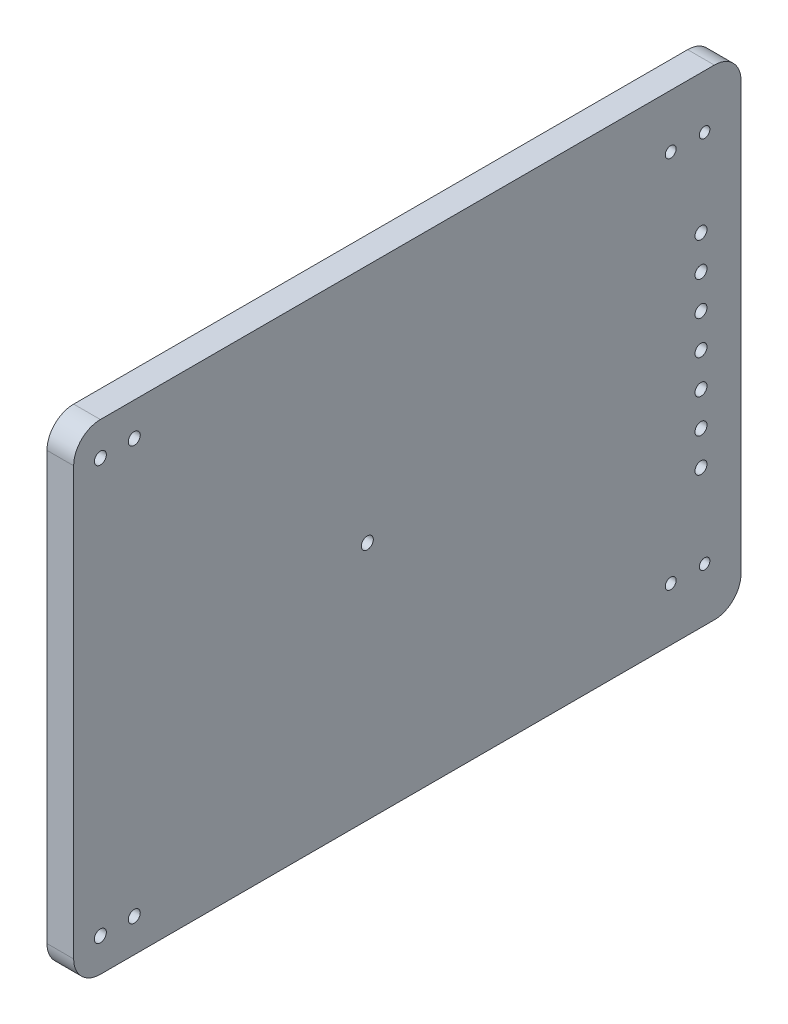
ISO-10303-21;
HEADER;
FILE_DESCRIPTION(('STEP AP214'),'2;1');
FILE_NAME('part.step','',(''),(''),'','','');
FILE_SCHEMA(('AUTOMOTIVE_DESIGN { 1 0 10303 214 1 1 1 1 }'));
ENDSEC;
DATA;
#1=APPLICATION_CONTEXT('core data for automotive mechanical design processes');
#2=APPLICATION_PROTOCOL_DEFINITION('international standard','automotive_design',2000,#1);
#3=PRODUCT_CONTEXT('',#1,'mechanical');
#4=PRODUCT('Part','Part','',(#3));
#5=PRODUCT_RELATED_PRODUCT_CATEGORY('part','',(#4));
#6=PRODUCT_DEFINITION_FORMATION('','',#4);
#7=PRODUCT_DEFINITION_CONTEXT('part definition',#1,'design');
#8=PRODUCT_DEFINITION('design','',#6,#7);
#9=PRODUCT_DEFINITION_SHAPE('','',#8);
#10=(LENGTH_UNIT() NAMED_UNIT(*) SI_UNIT(.MILLI.,.METRE.));
#11=(NAMED_UNIT(*) PLANE_ANGLE_UNIT() SI_UNIT($,.RADIAN.));
#12=(NAMED_UNIT(*) SI_UNIT($,.STERADIAN.) SOLID_ANGLE_UNIT());
#13=UNCERTAINTY_MEASURE_WITH_UNIT(LENGTH_MEASURE(1.E-05),#10,'distance_accuracy_value','');
#14=(GEOMETRIC_REPRESENTATION_CONTEXT(3) GLOBAL_UNCERTAINTY_ASSIGNED_CONTEXT((#13)) GLOBAL_UNIT_ASSIGNED_CONTEXT((#10,
#11,#12)) REPRESENTATION_CONTEXT('',''));
#15=CARTESIAN_POINT('',(0.,0.,0.));
#16=DIRECTION('',(0.,0.,1.));
#17=DIRECTION('',(1.,0.,0.));
#18=AXIS2_PLACEMENT_3D('',#15,#16,#17);
#19=CARTESIAN_POINT('',(1.,16.,-23.));
#20=DIRECTION('',(-1.,0.,0.));
#21=DIRECTION('',(0.,0.,1.));
#22=AXIS2_PLACEMENT_3D('',#19,#20,#21);
#23=PLANE('',#22);
#24=CARTESIAN_POINT('',(1.,-14.,-22.27));
#25=DIRECTION('',(-1.,0.,0.));
#26=DIRECTION('',(0.,0.,-1.));
#27=AXIS2_PLACEMENT_3D('',#24,#25,#26);
#28=CIRCLE('',#27,0.394878690123174);
#29=CARTESIAN_POINT('',(1.,-14.,-22.6648786901232));
#30=VERTEX_POINT('',#29);
#31=EDGE_CURVE('E210',#30,#30,#28,.T.);
#32=ORIENTED_EDGE('',*,*,#31,.T.);
#33=EDGE_LOOP('',(#32));
#34=FACE_BOUND('',#33,.T.);
#35=CARTESIAN_POINT('',(1.,14.,-19.73));
#36=DIRECTION('',(1.,0.,0.));
#37=DIRECTION('',(0.,0.,-1.));
#38=AXIS2_PLACEMENT_3D('',#35,#36,#37);
#39=CIRCLE('',#38,0.408155612703014);
#40=CARTESIAN_POINT('',(1.,14.,-20.138155612703));
#41=VERTEX_POINT('',#40);
#42=EDGE_CURVE('E216',#41,#41,#39,.T.);
#43=ORIENTED_EDGE('',*,*,#42,.F.);
#44=EDGE_LOOP('',(#43));
#45=FACE_BOUND('',#44,.T.);
#46=CARTESIAN_POINT('',(1.,14.,-22.27));
#47=DIRECTION('',(1.,0.,0.));
#48=DIRECTION('',(0.,0.,-1.));
#49=AXIS2_PLACEMENT_3D('',#46,#47,#48);
#50=CIRCLE('',#49,0.394878690123174);
#51=CARTESIAN_POINT('',(1.,14.,-22.6648786901232));
#52=VERTEX_POINT('',#51);
#53=EDGE_CURVE('E222',#52,#52,#50,.T.);
#54=ORIENTED_EDGE('',*,*,#53,.F.);
#55=EDGE_LOOP('',(#54));
#56=FACE_BOUND('',#55,.T.);
#57=CARTESIAN_POINT('',(1.,0.,3.00000000000002));
#58=DIRECTION('',(1.,0.,0.));
#59=DIRECTION('',(0.,0.,-1.));
#60=AXIS2_PLACEMENT_3D('',#57,#58,#59);
#61=CIRCLE('',#60,0.45);
#62=CARTESIAN_POINT('',(1.,0.,2.55000000000002));
#63=VERTEX_POINT('',#62);
#64=EDGE_CURVE('E228',#63,#63,#61,.T.);
#65=ORIENTED_EDGE('',*,*,#64,.F.);
#66=EDGE_LOOP('',(#65));
#67=FACE_BOUND('',#66,.T.);
#68=CARTESIAN_POINT('',(1.,5.08,-22.));
#69=DIRECTION('',(1.,0.,0.));
#70=DIRECTION('',(0.,0.,-1.));
#71=AXIS2_PLACEMENT_3D('',#68,#69,#70);
#72=CIRCLE('',#71,0.449999999999998);
#73=CARTESIAN_POINT('',(1.,5.08,-22.45));
#74=VERTEX_POINT('',#73);
#75=EDGE_CURVE('E239',#74,#74,#72,.T.);
#76=ORIENTED_EDGE('',*,*,#75,.F.);
#77=EDGE_LOOP('',(#76));
#78=FACE_BOUND('',#77,.T.);
#79=CARTESIAN_POINT('',(1.,7.62,-22.));
#80=DIRECTION('',(1.,0.,0.));
#81=DIRECTION('',(0.,0.,-1.));
#82=AXIS2_PLACEMENT_3D('',#79,#80,#81);
#83=CIRCLE('',#82,0.449999999999998);
#84=CARTESIAN_POINT('',(1.,7.62,-22.45));
#85=VERTEX_POINT('',#84);
#86=EDGE_CURVE('E242',#85,#85,#83,.T.);
#87=ORIENTED_EDGE('',*,*,#86,.F.);
#88=EDGE_LOOP('',(#87));
#89=FACE_BOUND('',#88,.T.);
#90=CARTESIAN_POINT('',(1.,-15.5,23.));
#91=DIRECTION('',(-1.,0.,0.));
#92=DIRECTION('',(0.,0.,-1.));
#93=AXIS2_PLACEMENT_3D('',#90,#91,#92);
#94=CIRCLE('',#93,0.449999999999999);
#95=CARTESIAN_POINT('',(1.,-15.5,22.55));
#96=VERTEX_POINT('',#95);
#97=EDGE_CURVE('E252',#96,#96,#94,.T.);
#98=ORIENTED_EDGE('',*,*,#97,.T.);
#99=EDGE_LOOP('',(#98));
#100=FACE_BOUND('',#99,.T.);
#101=CARTESIAN_POINT('',(1.,15.5,20.46));
#102=DIRECTION('',(1.,0.,0.));
#103=DIRECTION('',(0.,0.,-1.));
#104=AXIS2_PLACEMENT_3D('',#101,#102,#103);
#105=CIRCLE('',#104,0.449999999999999);
#106=CARTESIAN_POINT('',(1.,15.5,20.01));
#107=VERTEX_POINT('',#106);
#108=EDGE_CURVE('E258',#107,#107,#105,.T.);
#109=ORIENTED_EDGE('',*,*,#108,.F.);
#110=EDGE_LOOP('',(#109));
#111=FACE_BOUND('',#110,.T.);
#112=CARTESIAN_POINT('',(1.,15.5,23.));
#113=DIRECTION('',(1.,0.,0.));
#114=DIRECTION('',(0.,0.,-1.));
#115=AXIS2_PLACEMENT_3D('',#112,#113,#114);
#116=CIRCLE('',#115,0.449999999999999);
#117=CARTESIAN_POINT('',(1.,15.5,22.55));
#118=VERTEX_POINT('',#117);
#119=EDGE_CURVE('E264',#118,#118,#116,.T.);
#120=ORIENTED_EDGE('',*,*,#119,.F.);
#121=EDGE_LOOP('',(#120));
#122=FACE_BOUND('',#121,.T.);
#123=CARTESIAN_POINT('',(1.,16.,-23.));
#124=DIRECTION('',(1.,0.,0.));
#125=DIRECTION('',(0.,0.,1.));
#126=AXIS2_PLACEMENT_3D('',#123,#124,#125);
#127=CIRCLE('',#126,2.);
#128=CARTESIAN_POINT('',(1.,16.,-25.));
#129=VERTEX_POINT('',#128);
#130=CARTESIAN_POINT('',(1.,18.,-23.));
#131=VERTEX_POINT('',#130);
#132=EDGE_CURVE('E149',#129,#131,#127,.T.);
#133=ORIENTED_EDGE('',*,*,#132,.T.);
#134=DIRECTION('',(0.,0.,1.));
#135=VECTOR('',#134,1.);
#136=CARTESIAN_POINT('',(1.,18.,23.));
#137=LINE('',#136,#135);
#138=CARTESIAN_POINT('',(1.,18.,23.));
#139=VERTEX_POINT('',#138);
#140=EDGE_CURVE('E97',#131,#139,#137,.T.);
#141=ORIENTED_EDGE('',*,*,#140,.T.);
#142=CARTESIAN_POINT('',(1.,16.,23.));
#143=DIRECTION('',(1.,0.,0.));
#144=DIRECTION('',(0.,0.,-1.));
#145=AXIS2_PLACEMENT_3D('',#142,#143,#144);
#146=CIRCLE('',#145,2.);
#147=CARTESIAN_POINT('',(1.,16.,25.));
#148=VERTEX_POINT('',#147);
#149=EDGE_CURVE('E273',#139,#148,#146,.T.);
#150=ORIENTED_EDGE('',*,*,#149,.T.);
#151=DIRECTION('',(0.,-1.,0.));
#152=VECTOR('',#151,1.);
#153=CARTESIAN_POINT('',(1.,16.,25.));
#154=LINE('',#153,#152);
#155=CARTESIAN_POINT('',(1.,-16.,25.));
#156=VERTEX_POINT('',#155);
#157=EDGE_CURVE('E275',#148,#156,#154,.T.);
#158=ORIENTED_EDGE('',*,*,#157,.T.);
#159=CARTESIAN_POINT('',(1.,-16.,23.));
#160=DIRECTION('',(1.,0.,0.));
#161=DIRECTION('',(0.,0.,-1.));
#162=AXIS2_PLACEMENT_3D('',#159,#160,#161);
#163=CIRCLE('',#162,2.);
#164=CARTESIAN_POINT('',(1.,-18.,23.));
#165=VERTEX_POINT('',#164);
#166=EDGE_CURVE('E116',#156,#165,#163,.T.);
#167=ORIENTED_EDGE('',*,*,#166,.T.);
#168=DIRECTION('',(0.,0.,-1.));
#169=VECTOR('',#168,1.);
#170=CARTESIAN_POINT('',(1.,-18.,23.));
#171=LINE('',#170,#169);
#172=CARTESIAN_POINT('',(1.,-18.,-23.));
#173=VERTEX_POINT('',#172);
#174=EDGE_CURVE('E110',#165,#173,#171,.T.);
#175=ORIENTED_EDGE('',*,*,#174,.T.);
#176=CARTESIAN_POINT('',(1.,-16.,-23.));
#177=DIRECTION('',(1.,0.,0.));
#178=DIRECTION('',(0.,0.,-1.));
#179=AXIS2_PLACEMENT_3D('',#176,#177,#178);
#180=CIRCLE('',#179,2.);
#181=CARTESIAN_POINT('',(1.,-16.,-25.));
#182=VERTEX_POINT('',#181);
#183=EDGE_CURVE('E114',#173,#182,#180,.T.);
#184=ORIENTED_EDGE('',*,*,#183,.T.);
#185=DIRECTION('',(0.,1.,0.));
#186=VECTOR('',#185,1.);
#187=CARTESIAN_POINT('',(1.,16.,-25.));
#188=LINE('',#187,#186);
#189=EDGE_CURVE('E53',#182,#129,#188,.T.);
#190=ORIENTED_EDGE('',*,*,#189,.T.);
#191=EDGE_LOOP('',(#133,#141,#150,#158,#167,#175,#184,#190));
#192=FACE_BOUND('',#191,.T.);
#193=CARTESIAN_POINT('',(1.,-15.5,20.46));
#194=DIRECTION('',(-1.,0.,0.));
#195=DIRECTION('',(0.,0.,-1.));
#196=AXIS2_PLACEMENT_3D('',#193,#194,#195);
#197=CIRCLE('',#196,0.449999999999999);
#198=CARTESIAN_POINT('',(1.,-15.5,20.01));
#199=VERTEX_POINT('',#198);
#200=EDGE_CURVE('E246',#199,#199,#197,.T.);
#201=ORIENTED_EDGE('',*,*,#200,.T.);
#202=EDGE_LOOP('',(#201));
#203=FACE_BOUND('',#202,.T.);
#204=CARTESIAN_POINT('',(1.,2.54,-22.));
#205=DIRECTION('',(1.,0.,0.));
#206=DIRECTION('',(0.,0.,-1.));
#207=AXIS2_PLACEMENT_3D('',#204,#205,#206);
#208=CIRCLE('',#207,0.449999999999998);
#209=CARTESIAN_POINT('',(1.,2.54,-22.45));
#210=VERTEX_POINT('',#209);
#211=EDGE_CURVE('E167',#210,#210,#208,.T.);
#212=ORIENTED_EDGE('',*,*,#211,.F.);
#213=EDGE_LOOP('',(#212));
#214=FACE_BOUND('',#213,.T.);
#215=CARTESIAN_POINT('',(1.,0.,-22.));
#216=DIRECTION('',(1.,0.,0.));
#217=DIRECTION('',(0.,0.,-1.));
#218=AXIS2_PLACEMENT_3D('',#215,#216,#217);
#219=CIRCLE('',#218,0.449999999999998);
#220=CARTESIAN_POINT('',(1.,0.,-22.45));
#221=VERTEX_POINT('',#220);
#222=EDGE_CURVE('E173',#221,#221,#219,.T.);
#223=ORIENTED_EDGE('',*,*,#222,.F.);
#224=EDGE_LOOP('',(#223));
#225=FACE_BOUND('',#224,.T.);
#226=CARTESIAN_POINT('',(1.,-2.54,-22.));
#227=DIRECTION('',(1.,0.,0.));
#228=DIRECTION('',(0.,0.,-1.));
#229=AXIS2_PLACEMENT_3D('',#226,#227,#228);
#230=CIRCLE('',#229,0.449999999999998);
#231=CARTESIAN_POINT('',(1.,-2.54,-22.45));
#232=VERTEX_POINT('',#231);
#233=EDGE_CURVE('E179',#232,#232,#230,.T.);
#234=ORIENTED_EDGE('',*,*,#233,.F.);
#235=EDGE_LOOP('',(#234));
#236=FACE_BOUND('',#235,.T.);
#237=CARTESIAN_POINT('',(1.,-5.08,-22.));
#238=DIRECTION('',(1.,0.,0.));
#239=DIRECTION('',(0.,0.,-1.));
#240=AXIS2_PLACEMENT_3D('',#237,#238,#239);
#241=CIRCLE('',#240,0.449999999999998);
#242=CARTESIAN_POINT('',(1.,-5.08,-22.45));
#243=VERTEX_POINT('',#242);
#244=EDGE_CURVE('E185',#243,#243,#241,.T.);
#245=ORIENTED_EDGE('',*,*,#244,.F.);
#246=EDGE_LOOP('',(#245));
#247=FACE_BOUND('',#246,.T.);
#248=CARTESIAN_POINT('',(1.,-7.62,-22.));
#249=DIRECTION('',(1.,0.,0.));
#250=DIRECTION('',(0.,0.,-1.));
#251=AXIS2_PLACEMENT_3D('',#248,#249,#250);
#252=CIRCLE('',#251,0.449999999999998);
#253=CARTESIAN_POINT('',(1.,-7.62,-22.45));
#254=VERTEX_POINT('',#253);
#255=EDGE_CURVE('E11',#254,#254,#252,.T.);
#256=ORIENTED_EDGE('',*,*,#255,.F.);
#257=EDGE_LOOP('',(#256));
#258=FACE_BOUND('',#257,.T.);
#259=CARTESIAN_POINT('',(1.,-14.,-19.73));
#260=DIRECTION('',(-1.,0.,0.));
#261=DIRECTION('',(0.,0.,-1.));
#262=AXIS2_PLACEMENT_3D('',#259,#260,#261);
#263=CIRCLE('',#262,0.408155612703014);
#264=CARTESIAN_POINT('',(1.,-14.,-20.138155612703));
#265=VERTEX_POINT('',#264);
#266=EDGE_CURVE('E205',#265,#265,#263,.T.);
#267=ORIENTED_EDGE('',*,*,#266,.T.);
#268=EDGE_LOOP('',(#267));
#269=FACE_BOUND('',#268,.T.);
#270=ADVANCED_FACE('F36',(#34,#45,#56,#67,#78,#89,#100,#111,#122,#192,#203,#214,#225,#236,#247,
#258,#269),#23,.F.);
#271=CARTESIAN_POINT('',(-1.,16.,-23.));
#272=DIRECTION('',(-1.,0.,0.));
#273=DIRECTION('',(0.,0.,1.));
#274=AXIS2_PLACEMENT_3D('',#271,#272,#273);
#275=PLANE('',#274);
#276=CARTESIAN_POINT('',(-1.,-14.,-22.27));
#277=DIRECTION('',(-1.,0.,0.));
#278=DIRECTION('',(0.,0.,-1.));
#279=AXIS2_PLACEMENT_3D('',#276,#277,#278);
#280=CIRCLE('',#279,0.394878690123174);
#281=CARTESIAN_POINT('',(-1.,-14.,-22.6648786901232));
#282=VERTEX_POINT('',#281);
#283=EDGE_CURVE('E213',#282,#282,#280,.T.);
#284=ORIENTED_EDGE('',*,*,#283,.F.);
#285=EDGE_LOOP('',(#284));
#286=FACE_BOUND('',#285,.T.);
#287=CARTESIAN_POINT('',(-1.,14.,-19.73));
#288=DIRECTION('',(1.,0.,0.));
#289=DIRECTION('',(0.,0.,-1.));
#290=AXIS2_PLACEMENT_3D('',#287,#288,#289);
#291=CIRCLE('',#290,0.408155612703014);
#292=CARTESIAN_POINT('',(-1.,14.,-20.138155612703));
#293=VERTEX_POINT('',#292);
#294=EDGE_CURVE('E219',#293,#293,#291,.T.);
#295=ORIENTED_EDGE('',*,*,#294,.T.);
#296=EDGE_LOOP('',(#295));
#297=FACE_BOUND('',#296,.T.);
#298=CARTESIAN_POINT('',(-1.,14.,-22.27));
#299=DIRECTION('',(1.,0.,0.));
#300=DIRECTION('',(0.,0.,-1.));
#301=AXIS2_PLACEMENT_3D('',#298,#299,#300);
#302=CIRCLE('',#301,0.394878690123174);
#303=CARTESIAN_POINT('',(-1.,14.,-22.6648786901232));
#304=VERTEX_POINT('',#303);
#305=EDGE_CURVE('E225',#304,#304,#302,.T.);
#306=ORIENTED_EDGE('',*,*,#305,.T.);
#307=EDGE_LOOP('',(#306));
#308=FACE_BOUND('',#307,.T.);
#309=CARTESIAN_POINT('',(-1.,0.,3.00000000000002));
#310=DIRECTION('',(1.,0.,0.));
#311=DIRECTION('',(0.,0.,-1.));
#312=AXIS2_PLACEMENT_3D('',#309,#310,#311);
#313=CIRCLE('',#312,0.45);
#314=CARTESIAN_POINT('',(-1.,0.,2.55000000000002));
#315=VERTEX_POINT('',#314);
#316=EDGE_CURVE('E231',#315,#315,#313,.T.);
#317=ORIENTED_EDGE('',*,*,#316,.T.);
#318=EDGE_LOOP('',(#317));
#319=FACE_BOUND('',#318,.T.);
#320=CARTESIAN_POINT('',(-1.,5.08,-22.));
#321=DIRECTION('',(1.,0.,0.));
#322=DIRECTION('',(0.,0.,-1.));
#323=AXIS2_PLACEMENT_3D('',#320,#321,#322);
#324=CIRCLE('',#323,0.449999999999998);
#325=CARTESIAN_POINT('',(-1.,5.08,-22.45));
#326=VERTEX_POINT('',#325);
#327=EDGE_CURVE('E234',#326,#326,#324,.T.);
#328=ORIENTED_EDGE('',*,*,#327,.T.);
#329=EDGE_LOOP('',(#328));
#330=FACE_BOUND('',#329,.T.);
#331=CARTESIAN_POINT('',(-1.,7.62,-22.));
#332=DIRECTION('',(1.,0.,0.));
#333=DIRECTION('',(0.,0.,-1.));
#334=AXIS2_PLACEMENT_3D('',#331,#332,#333);
#335=CIRCLE('',#334,0.449999999999998);
#336=CARTESIAN_POINT('',(-1.,7.62,-22.45));
#337=VERTEX_POINT('',#336);
#338=EDGE_CURVE('E243',#337,#337,#335,.T.);
#339=ORIENTED_EDGE('',*,*,#338,.T.);
#340=EDGE_LOOP('',(#339));
#341=FACE_BOUND('',#340,.T.);
#342=CARTESIAN_POINT('',(-1.,-15.5,23.));
#343=DIRECTION('',(-1.,0.,0.));
#344=DIRECTION('',(0.,0.,-1.));
#345=AXIS2_PLACEMENT_3D('',#342,#343,#344);
#346=CIRCLE('',#345,0.449999999999999);
#347=CARTESIAN_POINT('',(-1.,-15.5,22.55));
#348=VERTEX_POINT('',#347);
#349=EDGE_CURVE('E255',#348,#348,#346,.T.);
#350=ORIENTED_EDGE('',*,*,#349,.F.);
#351=EDGE_LOOP('',(#350));
#352=FACE_BOUND('',#351,.T.);
#353=CARTESIAN_POINT('',(-1.,15.5,20.46));
#354=DIRECTION('',(1.,0.,0.));
#355=DIRECTION('',(0.,0.,-1.));
#356=AXIS2_PLACEMENT_3D('',#353,#354,#355);
#357=CIRCLE('',#356,0.449999999999999);
#358=CARTESIAN_POINT('',(-1.,15.5,20.01));
#359=VERTEX_POINT('',#358);
#360=EDGE_CURVE('E261',#359,#359,#357,.T.);
#361=ORIENTED_EDGE('',*,*,#360,.T.);
#362=EDGE_LOOP('',(#361));
#363=FACE_BOUND('',#362,.T.);
#364=CARTESIAN_POINT('',(-1.,15.5,23.));
#365=DIRECTION('',(1.,0.,0.));
#366=DIRECTION('',(0.,0.,-1.));
#367=AXIS2_PLACEMENT_3D('',#364,#365,#366);
#368=CIRCLE('',#367,0.449999999999999);
#369=CARTESIAN_POINT('',(-1.,15.5,22.55));
#370=VERTEX_POINT('',#369);
#371=EDGE_CURVE('E138',#370,#370,#368,.T.);
#372=ORIENTED_EDGE('',*,*,#371,.T.);
#373=EDGE_LOOP('',(#372));
#374=FACE_BOUND('',#373,.T.);
#375=CARTESIAN_POINT('',(-1.,16.,-23.));
#376=DIRECTION('',(1.,0.,0.));
#377=DIRECTION('',(0.,0.,1.));
#378=AXIS2_PLACEMENT_3D('',#375,#376,#377);
#379=CIRCLE('',#378,2.);
#380=CARTESIAN_POINT('',(-1.,16.,-25.));
#381=VERTEX_POINT('',#380);
#382=CARTESIAN_POINT('',(-1.,18.,-23.));
#383=VERTEX_POINT('',#382);
#384=EDGE_CURVE('E134',#381,#383,#379,.T.);
#385=ORIENTED_EDGE('',*,*,#384,.F.);
#386=DIRECTION('',(0.,1.,0.));
#387=VECTOR('',#386,1.);
#388=CARTESIAN_POINT('',(-1.,16.,-25.));
#389=LINE('',#388,#387);
#390=CARTESIAN_POINT('',(-1.,-16.,-25.));
#391=VERTEX_POINT('',#390);
#392=EDGE_CURVE('E88',#391,#381,#389,.T.);
#393=ORIENTED_EDGE('',*,*,#392,.F.);
#394=CARTESIAN_POINT('',(-1.,-16.,-23.));
#395=DIRECTION('',(1.,0.,0.));
#396=DIRECTION('',(0.,0.,-1.));
#397=AXIS2_PLACEMENT_3D('',#394,#395,#396);
#398=CIRCLE('',#397,2.);
#399=CARTESIAN_POINT('',(-1.,-18.,-23.));
#400=VERTEX_POINT('',#399);
#401=EDGE_CURVE('E82',#400,#391,#398,.T.);
#402=ORIENTED_EDGE('',*,*,#401,.F.);
#403=DIRECTION('',(0.,0.,-1.));
#404=VECTOR('',#403,1.);
#405=CARTESIAN_POINT('',(-1.,-18.,23.));
#406=LINE('',#405,#404);
#407=CARTESIAN_POINT('',(-1.,-18.,23.));
#408=VERTEX_POINT('',#407);
#409=EDGE_CURVE('E124',#408,#400,#406,.T.);
#410=ORIENTED_EDGE('',*,*,#409,.F.);
#411=CARTESIAN_POINT('',(-1.,-16.,23.));
#412=DIRECTION('',(1.,0.,0.));
#413=DIRECTION('',(0.,0.,-1.));
#414=AXIS2_PLACEMENT_3D('',#411,#412,#413);
#415=CIRCLE('',#414,2.);
#416=CARTESIAN_POINT('',(-1.,-16.,25.));
#417=VERTEX_POINT('',#416);
#418=EDGE_CURVE('E144',#417,#408,#415,.T.);
#419=ORIENTED_EDGE('',*,*,#418,.F.);
#420=DIRECTION('',(0.,-1.,0.));
#421=VECTOR('',#420,1.);
#422=CARTESIAN_POINT('',(-1.,16.,25.));
#423=LINE('',#422,#421);
#424=CARTESIAN_POINT('',(-1.,16.,25.));
#425=VERTEX_POINT('',#424);
#426=EDGE_CURVE('E142',#425,#417,#423,.T.);
#427=ORIENTED_EDGE('',*,*,#426,.F.);
#428=CARTESIAN_POINT('',(-1.,16.,23.));
#429=DIRECTION('',(1.,0.,0.));
#430=DIRECTION('',(0.,0.,-1.));
#431=AXIS2_PLACEMENT_3D('',#428,#429,#430);
#432=CIRCLE('',#431,2.);
#433=CARTESIAN_POINT('',(-1.,18.,23.));
#434=VERTEX_POINT('',#433);
#435=EDGE_CURVE('E140',#434,#425,#432,.T.);
#436=ORIENTED_EDGE('',*,*,#435,.F.);
#437=DIRECTION('',(0.,0.,1.));
#438=VECTOR('',#437,1.);
#439=CARTESIAN_POINT('',(-1.,18.,23.));
#440=LINE('',#439,#438);
#441=EDGE_CURVE('E137',#383,#434,#440,.T.);
#442=ORIENTED_EDGE('',*,*,#441,.F.);
#443=EDGE_LOOP('',(#385,#393,#402,#410,#419,#427,#436,#442));
#444=FACE_BOUND('',#443,.T.);
#445=CARTESIAN_POINT('',(-1.,-15.5,20.46));
#446=DIRECTION('',(-1.,0.,0.));
#447=DIRECTION('',(0.,0.,-1.));
#448=AXIS2_PLACEMENT_3D('',#445,#446,#447);
#449=CIRCLE('',#448,0.449999999999999);
#450=CARTESIAN_POINT('',(-1.,-15.5,20.01));
#451=VERTEX_POINT('',#450);
#452=EDGE_CURVE('E249',#451,#451,#449,.T.);
#453=ORIENTED_EDGE('',*,*,#452,.F.);
#454=EDGE_LOOP('',(#453));
#455=FACE_BOUND('',#454,.T.);
#456=CARTESIAN_POINT('',(-1.,2.54,-22.));
#457=DIRECTION('',(1.,0.,0.));
#458=DIRECTION('',(0.,0.,-1.));
#459=AXIS2_PLACEMENT_3D('',#456,#457,#458);
#460=CIRCLE('',#459,0.449999999999998);
#461=CARTESIAN_POINT('',(-1.,2.54,-22.45));
#462=VERTEX_POINT('',#461);
#463=EDGE_CURVE('E164',#462,#462,#460,.T.);
#464=ORIENTED_EDGE('',*,*,#463,.T.);
#465=EDGE_LOOP('',(#464));
#466=FACE_BOUND('',#465,.T.);
#467=CARTESIAN_POINT('',(-1.,0.,-22.));
#468=DIRECTION('',(1.,0.,0.));
#469=DIRECTION('',(0.,0.,-1.));
#470=AXIS2_PLACEMENT_3D('',#467,#468,#469);
#471=CIRCLE('',#470,0.449999999999998);
#472=CARTESIAN_POINT('',(-1.,0.,-22.45));
#473=VERTEX_POINT('',#472);
#474=EDGE_CURVE('E170',#473,#473,#471,.T.);
#475=ORIENTED_EDGE('',*,*,#474,.T.);
#476=EDGE_LOOP('',(#475));
#477=FACE_BOUND('',#476,.T.);
#478=CARTESIAN_POINT('',(-1.,-2.54,-22.));
#479=DIRECTION('',(1.,0.,0.));
#480=DIRECTION('',(0.,0.,-1.));
#481=AXIS2_PLACEMENT_3D('',#478,#479,#480);
#482=CIRCLE('',#481,0.449999999999998);
#483=CARTESIAN_POINT('',(-1.,-2.54,-22.45));
#484=VERTEX_POINT('',#483);
#485=EDGE_CURVE('E176',#484,#484,#482,.T.);
#486=ORIENTED_EDGE('',*,*,#485,.T.);
#487=EDGE_LOOP('',(#486));
#488=FACE_BOUND('',#487,.T.);
#489=CARTESIAN_POINT('',(-1.,-5.08,-22.));
#490=DIRECTION('',(1.,0.,0.));
#491=DIRECTION('',(0.,0.,-1.));
#492=AXIS2_PLACEMENT_3D('',#489,#490,#491);
#493=CIRCLE('',#492,0.449999999999998);
#494=CARTESIAN_POINT('',(-1.,-5.08,-22.45));
#495=VERTEX_POINT('',#494);
#496=EDGE_CURVE('E182',#495,#495,#493,.T.);
#497=ORIENTED_EDGE('',*,*,#496,.T.);
#498=EDGE_LOOP('',(#497));
#499=FACE_BOUND('',#498,.T.);
#500=CARTESIAN_POINT('',(-1.,-7.62,-22.));
#501=DIRECTION('',(1.,0.,0.));
#502=DIRECTION('',(0.,0.,-1.));
#503=AXIS2_PLACEMENT_3D('',#500,#501,#502);
#504=CIRCLE('',#503,0.449999999999998);
#505=CARTESIAN_POINT('',(-1.,-7.62,-22.45));
#506=VERTEX_POINT('',#505);
#507=EDGE_CURVE('E45',#506,#506,#504,.T.);
#508=ORIENTED_EDGE('',*,*,#507,.T.);
#509=EDGE_LOOP('',(#508));
#510=FACE_BOUND('',#509,.T.);
#511=CARTESIAN_POINT('',(-1.,-14.,-19.73));
#512=DIRECTION('',(-1.,0.,0.));
#513=DIRECTION('',(0.,0.,-1.));
#514=AXIS2_PLACEMENT_3D('',#511,#512,#513);
#515=CIRCLE('',#514,0.408155612703014);
#516=CARTESIAN_POINT('',(-1.,-14.,-20.138155612703));
#517=VERTEX_POINT('',#516);
#518=EDGE_CURVE('E207',#517,#517,#515,.T.);
#519=ORIENTED_EDGE('',*,*,#518,.F.);
#520=EDGE_LOOP('',(#519));
#521=FACE_BOUND('',#520,.T.);
#522=ADVANCED_FACE('F190',(#286,#297,#308,#319,#330,#341,#352,#363,#374,#444,#455,#466,#477,
#488,#499,#510,#521),#275,.T.);
#523=CARTESIAN_POINT('',(1.,16.,-23.));
#524=DIRECTION('',(-1.,0.,0.));
#525=DIRECTION('',(0.,0.,1.));
#526=AXIS2_PLACEMENT_3D('',#523,#524,#525);
#527=CYLINDRICAL_SURFACE('',#526,2.);
#528=ORIENTED_EDGE('',*,*,#384,.T.);
#529=DIRECTION('',(-1.,0.,0.));
#530=VECTOR('',#529,1.);
#531=CARTESIAN_POINT('',(1.,18.,-23.));
#532=LINE('',#531,#530);
#533=EDGE_CURVE('E162',#131,#383,#532,.T.);
#534=ORIENTED_EDGE('',*,*,#533,.F.);
#535=ORIENTED_EDGE('',*,*,#132,.F.);
#536=DIRECTION('',(-1.,0.,0.));
#537=VECTOR('',#536,1.);
#538=CARTESIAN_POINT('',(1.,16.,-25.));
#539=LINE('',#538,#537);
#540=EDGE_CURVE('E130',#129,#381,#539,.T.);
#541=ORIENTED_EDGE('',*,*,#540,.T.);
#542=EDGE_LOOP('',(#528,#534,#535,#541));
#543=FACE_BOUND('',#542,.T.);
#544=ADVANCED_FACE('F292',(#543),#527,.T.);
#545=CARTESIAN_POINT('',(1.,18.,23.));
#546=DIRECTION('',(0.,-1.,0.));
#547=DIRECTION('',(0.,0.,-1.));
#548=AXIS2_PLACEMENT_3D('',#545,#546,#547);
#549=PLANE('',#548);
#550=ORIENTED_EDGE('',*,*,#441,.T.);
#551=DIRECTION('',(-1.,0.,0.));
#552=VECTOR('',#551,1.);
#553=CARTESIAN_POINT('',(1.,18.,23.));
#554=LINE('',#553,#552);
#555=EDGE_CURVE('E159',#139,#434,#554,.T.);
#556=ORIENTED_EDGE('',*,*,#555,.F.);
#557=ORIENTED_EDGE('',*,*,#140,.F.);
#558=ORIENTED_EDGE('',*,*,#533,.T.);
#559=EDGE_LOOP('',(#550,#556,#557,#558));
#560=FACE_BOUND('',#559,.T.);
#561=ADVANCED_FACE('F317',(#560),#549,.F.);
#562=CARTESIAN_POINT('',(1.,16.,23.));
#563=DIRECTION('',(-1.,0.,0.));
#564=DIRECTION('',(0.,0.,1.));
#565=AXIS2_PLACEMENT_3D('',#562,#563,#564);
#566=CYLINDRICAL_SURFACE('',#565,2.);
#567=ORIENTED_EDGE('',*,*,#435,.T.);
#568=DIRECTION('',(-1.,0.,0.));
#569=VECTOR('',#568,1.);
#570=CARTESIAN_POINT('',(1.,16.,25.));
#571=LINE('',#570,#569);
#572=EDGE_CURVE('E156',#148,#425,#571,.T.);
#573=ORIENTED_EDGE('',*,*,#572,.F.);
#574=ORIENTED_EDGE('',*,*,#149,.F.);
#575=ORIENTED_EDGE('',*,*,#555,.T.);
#576=EDGE_LOOP('',(#567,#573,#574,#575));
#577=FACE_BOUND('',#576,.T.);
#578=ADVANCED_FACE('F314',(#577),#566,.T.);
#579=CARTESIAN_POINT('',(1.,16.,25.));
#580=DIRECTION('',(0.,0.,-1.));
#581=DIRECTION('',(0.,1.,0.));
#582=AXIS2_PLACEMENT_3D('',#579,#580,#581);
#583=PLANE('',#582);
#584=ORIENTED_EDGE('',*,*,#426,.T.);
#585=DIRECTION('',(-1.,0.,0.));
#586=VECTOR('',#585,1.);
#587=CARTESIAN_POINT('',(1.,-16.,25.));
#588=LINE('',#587,#586);
#589=EDGE_CURVE('E153',#156,#417,#588,.T.);
#590=ORIENTED_EDGE('',*,*,#589,.F.);
#591=ORIENTED_EDGE('',*,*,#157,.F.);
#592=ORIENTED_EDGE('',*,*,#572,.T.);
#593=EDGE_LOOP('',(#584,#590,#591,#592));
#594=FACE_BOUND('',#593,.T.);
#595=ADVANCED_FACE('F281',(#594),#583,.F.);
#596=CARTESIAN_POINT('',(1.,-16.,23.));
#597=DIRECTION('',(-1.,0.,0.));
#598=DIRECTION('',(0.,0.,1.));
#599=AXIS2_PLACEMENT_3D('',#596,#597,#598);
#600=CYLINDRICAL_SURFACE('',#599,2.);
#601=ORIENTED_EDGE('',*,*,#418,.T.);
#602=DIRECTION('',(-1.,0.,0.));
#603=VECTOR('',#602,1.);
#604=CARTESIAN_POINT('',(1.,-18.,23.));
#605=LINE('',#604,#603);
#606=EDGE_CURVE('E125',#165,#408,#605,.T.);
#607=ORIENTED_EDGE('',*,*,#606,.F.);
#608=ORIENTED_EDGE('',*,*,#166,.F.);
#609=ORIENTED_EDGE('',*,*,#589,.T.);
#610=EDGE_LOOP('',(#601,#607,#608,#609));
#611=FACE_BOUND('',#610,.T.);
#612=ADVANCED_FACE('F285',(#611),#600,.T.);
#613=CARTESIAN_POINT('',(1.,-18.,23.));
#614=DIRECTION('',(0.,1.,0.));
#615=DIRECTION('',(0.,0.,1.));
#616=AXIS2_PLACEMENT_3D('',#613,#614,#615);
#617=PLANE('',#616);
#618=ORIENTED_EDGE('',*,*,#409,.T.);
#619=DIRECTION('',(-1.,0.,0.));
#620=VECTOR('',#619,1.);
#621=CARTESIAN_POINT('',(1.,-18.,-23.));
#622=LINE('',#621,#620);
#623=EDGE_CURVE('E121',#173,#400,#622,.T.);
#624=ORIENTED_EDGE('',*,*,#623,.F.);
#625=ORIENTED_EDGE('',*,*,#174,.F.);
#626=ORIENTED_EDGE('',*,*,#606,.T.);
#627=EDGE_LOOP('',(#618,#624,#625,#626));
#628=FACE_BOUND('',#627,.T.);
#629=ADVANCED_FACE('F122',(#628),#617,.F.);
#630=CARTESIAN_POINT('',(1.,-16.,-23.));
#631=DIRECTION('',(-1.,0.,0.));
#632=DIRECTION('',(0.,0.,1.));
#633=AXIS2_PLACEMENT_3D('',#630,#631,#632);
#634=CYLINDRICAL_SURFACE('',#633,2.);
#635=ORIENTED_EDGE('',*,*,#401,.T.);
#636=DIRECTION('',(-1.,0.,0.));
#637=VECTOR('',#636,1.);
#638=CARTESIAN_POINT('',(1.,-16.,-25.));
#639=LINE('',#638,#637);
#640=EDGE_CURVE('E126',#182,#391,#639,.T.);
#641=ORIENTED_EDGE('',*,*,#640,.F.);
#642=ORIENTED_EDGE('',*,*,#183,.F.);
#643=ORIENTED_EDGE('',*,*,#623,.T.);
#644=EDGE_LOOP('',(#635,#641,#642,#643));
#645=FACE_BOUND('',#644,.T.);
#646=ADVANCED_FACE('F128',(#645),#634,.T.);
#647=CARTESIAN_POINT('',(1.,16.,-25.));
#648=DIRECTION('',(0.,0.,1.));
#649=DIRECTION('',(0.,-1.,0.));
#650=AXIS2_PLACEMENT_3D('',#647,#648,#649);
#651=PLANE('',#650);
#652=ORIENTED_EDGE('',*,*,#392,.T.);
#653=ORIENTED_EDGE('',*,*,#540,.F.);
#654=ORIENTED_EDGE('',*,*,#189,.F.);
#655=ORIENTED_EDGE('',*,*,#640,.T.);
#656=EDGE_LOOP('',(#652,#653,#654,#655));
#657=FACE_BOUND('',#656,.T.);
#658=ADVANCED_FACE('F294',(#657),#651,.F.);
#659=CARTESIAN_POINT('',(-1.,15.5,23.));
#660=DIRECTION('',(1.,0.,0.));
#661=DIRECTION('',(0.,0.,-1.));
#662=AXIS2_PLACEMENT_3D('',#659,#660,#661);
#663=CYLINDRICAL_SURFACE('',#662,0.449999999999999);
#664=ORIENTED_EDGE('',*,*,#371,.F.);
#665=EDGE_LOOP('',(#664));
#666=FACE_BOUND('',#665,.T.);
#667=ORIENTED_EDGE('',*,*,#119,.T.);
#668=EDGE_LOOP('',(#667));
#669=FACE_BOUND('',#668,.T.);
#670=ADVANCED_FACE('F296',(#666,#669),#663,.F.);
#671=CARTESIAN_POINT('',(-1.,15.5,20.46));
#672=DIRECTION('',(1.,0.,0.));
#673=DIRECTION('',(0.,0.,-1.));
#674=AXIS2_PLACEMENT_3D('',#671,#672,#673);
#675=CYLINDRICAL_SURFACE('',#674,0.449999999999999);
#676=ORIENTED_EDGE('',*,*,#360,.F.);
#677=EDGE_LOOP('',(#676));
#678=FACE_BOUND('',#677,.T.);
#679=ORIENTED_EDGE('',*,*,#108,.T.);
#680=EDGE_LOOP('',(#679));
#681=FACE_BOUND('',#680,.T.);
#682=ADVANCED_FACE('F302',(#678,#681),#675,.F.);
#683=CARTESIAN_POINT('',(-1.,-15.5,23.));
#684=DIRECTION('',(1.,0.,0.));
#685=DIRECTION('',(0.,0.,-1.));
#686=AXIS2_PLACEMENT_3D('',#683,#684,#685);
#687=CYLINDRICAL_SURFACE('',#686,0.449999999999999);
#688=ORIENTED_EDGE('',*,*,#349,.T.);
#689=EDGE_LOOP('',(#688));
#690=FACE_BOUND('',#689,.T.);
#691=ORIENTED_EDGE('',*,*,#97,.F.);
#692=EDGE_LOOP('',(#691));
#693=FACE_BOUND('',#692,.T.);
#694=ADVANCED_FACE('F371',(#690,#693),#687,.F.);
#695=CARTESIAN_POINT('',(-1.,-15.5,20.46));
#696=DIRECTION('',(1.,0.,0.));
#697=DIRECTION('',(0.,0.,-1.));
#698=AXIS2_PLACEMENT_3D('',#695,#696,#697);
#699=CYLINDRICAL_SURFACE('',#698,0.449999999999999);
#700=ORIENTED_EDGE('',*,*,#452,.T.);
#701=EDGE_LOOP('',(#700));
#702=FACE_BOUND('',#701,.T.);
#703=ORIENTED_EDGE('',*,*,#200,.F.);
#704=EDGE_LOOP('',(#703));
#705=FACE_BOUND('',#704,.T.);
#706=ADVANCED_FACE('F378',(#702,#705),#699,.F.);
#707=CARTESIAN_POINT('',(-1.,7.62,-22.));
#708=DIRECTION('',(1.,0.,0.));
#709=DIRECTION('',(0.,0.,-1.));
#710=AXIS2_PLACEMENT_3D('',#707,#708,#709);
#711=CYLINDRICAL_SURFACE('',#710,0.449999999999998);
#712=ORIENTED_EDGE('',*,*,#338,.F.);
#713=EDGE_LOOP('',(#712));
#714=FACE_BOUND('',#713,.T.);
#715=ORIENTED_EDGE('',*,*,#86,.T.);
#716=EDGE_LOOP('',(#715));
#717=FACE_BOUND('',#716,.T.);
#718=ADVANCED_FACE('F384',(#714,#717),#711,.F.);
#719=CARTESIAN_POINT('',(-1.,5.08,-22.));
#720=DIRECTION('',(1.,0.,0.));
#721=DIRECTION('',(0.,0.,-1.));
#722=AXIS2_PLACEMENT_3D('',#719,#720,#721);
#723=CYLINDRICAL_SURFACE('',#722,0.449999999999998);
#724=ORIENTED_EDGE('',*,*,#327,.F.);
#725=EDGE_LOOP('',(#724));
#726=FACE_BOUND('',#725,.T.);
#727=ORIENTED_EDGE('',*,*,#75,.T.);
#728=EDGE_LOOP('',(#727));
#729=FACE_BOUND('',#728,.T.);
#730=ADVANCED_FACE('F327',(#726,#729),#723,.F.);
#731=CARTESIAN_POINT('',(-1.,2.54,-22.));
#732=DIRECTION('',(1.,0.,0.));
#733=DIRECTION('',(0.,0.,-1.));
#734=AXIS2_PLACEMENT_3D('',#731,#732,#733);
#735=CYLINDRICAL_SURFACE('',#734,0.449999999999998);
#736=ORIENTED_EDGE('',*,*,#463,.F.);
#737=EDGE_LOOP('',(#736));
#738=FACE_BOUND('',#737,.T.);
#739=ORIENTED_EDGE('',*,*,#211,.T.);
#740=EDGE_LOOP('',(#739));
#741=FACE_BOUND('',#740,.T.);
#742=ADVANCED_FACE('F323',(#738,#741),#735,.F.);
#743=CARTESIAN_POINT('',(-1.,0.,-22.));
#744=DIRECTION('',(1.,0.,0.));
#745=DIRECTION('',(0.,0.,-1.));
#746=AXIS2_PLACEMENT_3D('',#743,#744,#745);
#747=CYLINDRICAL_SURFACE('',#746,0.449999999999998);
#748=ORIENTED_EDGE('',*,*,#474,.F.);
#749=EDGE_LOOP('',(#748));
#750=FACE_BOUND('',#749,.T.);
#751=ORIENTED_EDGE('',*,*,#222,.T.);
#752=EDGE_LOOP('',(#751));
#753=FACE_BOUND('',#752,.T.);
#754=ADVANCED_FACE('F326',(#750,#753),#747,.F.);
#755=CARTESIAN_POINT('',(-1.,-2.54,-22.));
#756=DIRECTION('',(1.,0.,0.));
#757=DIRECTION('',(0.,0.,-1.));
#758=AXIS2_PLACEMENT_3D('',#755,#756,#757);
#759=CYLINDRICAL_SURFACE('',#758,0.449999999999998);
#760=ORIENTED_EDGE('',*,*,#485,.F.);
#761=EDGE_LOOP('',(#760));
#762=FACE_BOUND('',#761,.T.);
#763=ORIENTED_EDGE('',*,*,#233,.T.);
#764=EDGE_LOOP('',(#763));
#765=FACE_BOUND('',#764,.T.);
#766=ADVANCED_FACE('F331',(#762,#765),#759,.F.);
#767=CARTESIAN_POINT('',(-1.,-5.08,-22.));
#768=DIRECTION('',(1.,0.,0.));
#769=DIRECTION('',(0.,0.,-1.));
#770=AXIS2_PLACEMENT_3D('',#767,#768,#769);
#771=CYLINDRICAL_SURFACE('',#770,0.449999999999998);
#772=ORIENTED_EDGE('',*,*,#496,.F.);
#773=EDGE_LOOP('',(#772));
#774=FACE_BOUND('',#773,.T.);
#775=ORIENTED_EDGE('',*,*,#244,.T.);
#776=EDGE_LOOP('',(#775));
#777=FACE_BOUND('',#776,.T.);
#778=ADVANCED_FACE('F196',(#774,#777),#771,.F.);
#779=CARTESIAN_POINT('',(-1.,-7.62,-22.));
#780=DIRECTION('',(1.,0.,0.));
#781=DIRECTION('',(0.,0.,-1.));
#782=AXIS2_PLACEMENT_3D('',#779,#780,#781);
#783=CYLINDRICAL_SURFACE('',#782,0.449999999999998);
#784=ORIENTED_EDGE('',*,*,#507,.F.);
#785=EDGE_LOOP('',(#784));
#786=FACE_BOUND('',#785,.T.);
#787=ORIENTED_EDGE('',*,*,#255,.T.);
#788=EDGE_LOOP('',(#787));
#789=FACE_BOUND('',#788,.T.);
#790=ADVANCED_FACE('F38',(#786,#789),#783,.F.);
#791=CARTESIAN_POINT('',(-1.,0.,3.00000000000002));
#792=DIRECTION('',(1.,0.,0.));
#793=DIRECTION('',(0.,0.,-1.));
#794=AXIS2_PLACEMENT_3D('',#791,#792,#793);
#795=CYLINDRICAL_SURFACE('',#794,0.45);
#796=ORIENTED_EDGE('',*,*,#316,.F.);
#797=EDGE_LOOP('',(#796));
#798=FACE_BOUND('',#797,.T.);
#799=ORIENTED_EDGE('',*,*,#64,.T.);
#800=EDGE_LOOP('',(#799));
#801=FACE_BOUND('',#800,.T.);
#802=ADVANCED_FACE('F195',(#798,#801),#795,.F.);
#803=CARTESIAN_POINT('',(-1.,14.,-22.27));
#804=DIRECTION('',(1.,0.,0.));
#805=DIRECTION('',(0.,0.,-1.));
#806=AXIS2_PLACEMENT_3D('',#803,#804,#805);
#807=CYLINDRICAL_SURFACE('',#806,0.394878690123174);
#808=ORIENTED_EDGE('',*,*,#305,.F.);
#809=EDGE_LOOP('',(#808));
#810=FACE_BOUND('',#809,.T.);
#811=ORIENTED_EDGE('',*,*,#53,.T.);
#812=EDGE_LOOP('',(#811));
#813=FACE_BOUND('',#812,.T.);
#814=ADVANCED_FACE('F394',(#810,#813),#807,.F.);
#815=CARTESIAN_POINT('',(-1.,14.,-19.73));
#816=DIRECTION('',(1.,0.,0.));
#817=DIRECTION('',(0.,0.,-1.));
#818=AXIS2_PLACEMENT_3D('',#815,#816,#817);
#819=CYLINDRICAL_SURFACE('',#818,0.408155612703014);
#820=ORIENTED_EDGE('',*,*,#294,.F.);
#821=EDGE_LOOP('',(#820));
#822=FACE_BOUND('',#821,.T.);
#823=ORIENTED_EDGE('',*,*,#42,.T.);
#824=EDGE_LOOP('',(#823));
#825=FACE_BOUND('',#824,.T.);
#826=ADVANCED_FACE('F398',(#822,#825),#819,.F.);
#827=CARTESIAN_POINT('',(-1.,-14.,-22.27));
#828=DIRECTION('',(1.,0.,0.));
#829=DIRECTION('',(0.,0.,-1.));
#830=AXIS2_PLACEMENT_3D('',#827,#828,#829);
#831=CYLINDRICAL_SURFACE('',#830,0.394878690123174);
#832=ORIENTED_EDGE('',*,*,#283,.T.);
#833=EDGE_LOOP('',(#832));
#834=FACE_BOUND('',#833,.T.);
#835=ORIENTED_EDGE('',*,*,#31,.F.);
#836=EDGE_LOOP('',(#835));
#837=FACE_BOUND('',#836,.T.);
#838=ADVANCED_FACE('F402',(#834,#837),#831,.F.);
#839=CARTESIAN_POINT('',(-1.,-14.,-19.73));
#840=DIRECTION('',(1.,0.,0.));
#841=DIRECTION('',(0.,0.,-1.));
#842=AXIS2_PLACEMENT_3D('',#839,#840,#841);
#843=CYLINDRICAL_SURFACE('',#842,0.408155612703014);
#844=ORIENTED_EDGE('',*,*,#518,.T.);
#845=EDGE_LOOP('',(#844));
#846=FACE_BOUND('',#845,.T.);
#847=ORIENTED_EDGE('',*,*,#266,.F.);
#848=EDGE_LOOP('',(#847));
#849=FACE_BOUND('',#848,.T.);
#850=ADVANCED_FACE('F406',(#846,#849),#843,.F.);
#851=CLOSED_SHELL('',(#270,#522,#544,#561,#578,#595,#612,#629,#646,#658,#670,#682,#694,#706,
#718,#730,#742,#754,#766,#778,#790,#802,#814,#826,#838,#850));
#852=MANIFOLD_SOLID_BREP('B2',#851);
#853=ADVANCED_BREP_SHAPE_REPRESENTATION('',(#18,#852),#14);
#854=SHAPE_DEFINITION_REPRESENTATION(#9,#853);
ENDSEC;
END-ISO-10303-21;
